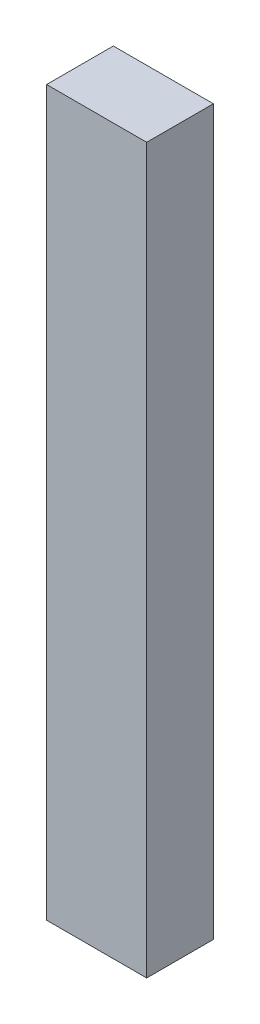
ISO-10303-21;
HEADER;
FILE_DESCRIPTION(('STEP AP214'),'2;1');
FILE_NAME('part.step','',(''),(''),'','','');
FILE_SCHEMA(('AUTOMOTIVE_DESIGN { 1 0 10303 214 1 1 1 1 }'));
ENDSEC;
DATA;
#1=APPLICATION_CONTEXT('core data for automotive mechanical design processes');
#2=APPLICATION_PROTOCOL_DEFINITION('international standard','automotive_design',2000,#1);
#3=PRODUCT_CONTEXT('',#1,'mechanical');
#4=PRODUCT('Part','Part','',(#3));
#5=PRODUCT_RELATED_PRODUCT_CATEGORY('part','',(#4));
#6=PRODUCT_DEFINITION_FORMATION('','',#4);
#7=PRODUCT_DEFINITION_CONTEXT('part definition',#1,'design');
#8=PRODUCT_DEFINITION('design','',#6,#7);
#9=PRODUCT_DEFINITION_SHAPE('','',#8);
#10=(LENGTH_UNIT() NAMED_UNIT(*) SI_UNIT(.MILLI.,.METRE.));
#11=(NAMED_UNIT(*) PLANE_ANGLE_UNIT() SI_UNIT($,.RADIAN.));
#12=(NAMED_UNIT(*) SI_UNIT($,.STERADIAN.) SOLID_ANGLE_UNIT());
#13=UNCERTAINTY_MEASURE_WITH_UNIT(LENGTH_MEASURE(1.E-05),#10,'distance_accuracy_value','');
#14=(GEOMETRIC_REPRESENTATION_CONTEXT(3) GLOBAL_UNCERTAINTY_ASSIGNED_CONTEXT((#13)) GLOBAL_UNIT_ASSIGNED_CONTEXT((#10,
#11,#12)) REPRESENTATION_CONTEXT('',''));
#15=CARTESIAN_POINT('',(0.,0.,0.));
#16=DIRECTION('',(0.,0.,1.));
#17=DIRECTION('',(1.,0.,0.));
#18=AXIS2_PLACEMENT_3D('',#15,#16,#17);
#19=CARTESIAN_POINT('',(-47.4736842105263,217.,-7.18421052631578));
#20=DIRECTION('',(1.,0.,0.));
#21=DIRECTION('',(0.,0.,-1.));
#22=AXIS2_PLACEMENT_3D('',#19,#20,#21);
#23=PLANE('',#22);
#24=DIRECTION('',(0.,0.,1.));
#25=VECTOR('',#24,1.);
#26=CARTESIAN_POINT('',(-47.4736842105263,0.,-7.18421052631578));
#27=LINE('',#26,#25);
#28=CARTESIAN_POINT('',(-47.4736842105263,0.,-7.18421052631578));
#29=VERTEX_POINT('',#28);
#30=CARTESIAN_POINT('',(-47.4736842105263,0.,12.8157894736842));
#31=VERTEX_POINT('',#30);
#32=EDGE_CURVE('E104',#29,#31,#27,.T.);
#33=ORIENTED_EDGE('',*,*,#32,.T.);
#34=DIRECTION('',(0.,-1.,0.));
#35=VECTOR('',#34,1.);
#36=CARTESIAN_POINT('',(-47.4736842105263,217.,12.8157894736842));
#37=LINE('',#36,#35);
#38=CARTESIAN_POINT('',(-47.4736842105263,217.,12.8157894736842));
#39=VERTEX_POINT('',#38);
#40=EDGE_CURVE('E11',#39,#31,#37,.T.);
#41=ORIENTED_EDGE('',*,*,#40,.F.);
#42=DIRECTION('',(0.,0.,1.));
#43=VECTOR('',#42,1.);
#44=CARTESIAN_POINT('',(-47.4736842105263,217.,-7.18421052631578));
#45=LINE('',#44,#43);
#46=CARTESIAN_POINT('',(-47.4736842105263,217.,-7.18421052631578));
#47=VERTEX_POINT('',#46);
#48=EDGE_CURVE('E92',#47,#39,#45,.T.);
#49=ORIENTED_EDGE('',*,*,#48,.F.);
#50=DIRECTION('',(0.,-1.,0.));
#51=VECTOR('',#50,1.);
#52=CARTESIAN_POINT('',(-47.4736842105263,217.,-7.18421052631578));
#53=LINE('',#52,#51);
#54=EDGE_CURVE('E100',#47,#29,#53,.T.);
#55=ORIENTED_EDGE('',*,*,#54,.T.);
#56=EDGE_LOOP('',(#33,#41,#49,#55));
#57=FACE_BOUND('',#56,.T.);
#58=ADVANCED_FACE('F41',(#57),#23,.F.);
#59=CARTESIAN_POINT('',(-47.4736842105263,217.,12.8157894736842));
#60=DIRECTION('',(0.,0.,-1.));
#61=DIRECTION('',(-1.,0.,0.));
#62=AXIS2_PLACEMENT_3D('',#59,#60,#61);
#63=PLANE('',#62);
#64=DIRECTION('',(1.,0.,0.));
#65=VECTOR('',#64,1.);
#66=CARTESIAN_POINT('',(-47.4736842105263,0.,12.8157894736842));
#67=LINE('',#66,#65);
#68=CARTESIAN_POINT('',(-17.4736842105263,0.,12.8157894736842));
#69=VERTEX_POINT('',#68);
#70=EDGE_CURVE('E96',#31,#69,#67,.T.);
#71=ORIENTED_EDGE('',*,*,#70,.T.);
#72=DIRECTION('',(0.,-1.,0.));
#73=VECTOR('',#72,1.);
#74=CARTESIAN_POINT('',(-17.4736842105263,217.,12.8157894736842));
#75=LINE('',#74,#73);
#76=CARTESIAN_POINT('',(-17.4736842105263,217.,12.8157894736842));
#77=VERTEX_POINT('',#76);
#78=EDGE_CURVE('E49',#77,#69,#75,.T.);
#79=ORIENTED_EDGE('',*,*,#78,.F.);
#80=DIRECTION('',(1.,0.,0.));
#81=VECTOR('',#80,1.);
#82=CARTESIAN_POINT('',(-47.4736842105263,217.,12.8157894736842));
#83=LINE('',#82,#81);
#84=EDGE_CURVE('E87',#39,#77,#83,.T.);
#85=ORIENTED_EDGE('',*,*,#84,.F.);
#86=ORIENTED_EDGE('',*,*,#40,.T.);
#87=EDGE_LOOP('',(#71,#79,#85,#86));
#88=FACE_BOUND('',#87,.T.);
#89=ADVANCED_FACE('F95',(#88),#63,.F.);
#90=CARTESIAN_POINT('',(-17.4736842105263,217.,-7.18421052631578));
#91=DIRECTION('',(-1.,0.,0.));
#92=DIRECTION('',(0.,0.,1.));
#93=AXIS2_PLACEMENT_3D('',#90,#91,#92);
#94=PLANE('',#93);
#95=DIRECTION('',(0.,0.,-1.));
#96=VECTOR('',#95,1.);
#97=CARTESIAN_POINT('',(-17.4736842105263,0.,-7.18421052631578));
#98=LINE('',#97,#96);
#99=CARTESIAN_POINT('',(-17.4736842105263,0.,-7.18421052631578));
#100=VERTEX_POINT('',#99);
#101=EDGE_CURVE('E74',#69,#100,#98,.T.);
#102=ORIENTED_EDGE('',*,*,#101,.T.);
#103=DIRECTION('',(0.,-1.,0.));
#104=VECTOR('',#103,1.);
#105=CARTESIAN_POINT('',(-17.4736842105263,217.,-7.18421052631578));
#106=LINE('',#105,#104);
#107=CARTESIAN_POINT('',(-17.4736842105263,217.,-7.18421052631578));
#108=VERTEX_POINT('',#107);
#109=EDGE_CURVE('E97',#108,#100,#106,.T.);
#110=ORIENTED_EDGE('',*,*,#109,.F.);
#111=DIRECTION('',(0.,0.,-1.));
#112=VECTOR('',#111,1.);
#113=CARTESIAN_POINT('',(-17.4736842105263,217.,-7.18421052631578));
#114=LINE('',#113,#112);
#115=EDGE_CURVE('E90',#77,#108,#114,.T.);
#116=ORIENTED_EDGE('',*,*,#115,.F.);
#117=ORIENTED_EDGE('',*,*,#78,.T.);
#118=EDGE_LOOP('',(#102,#110,#116,#117));
#119=FACE_BOUND('',#118,.T.);
#120=ADVANCED_FACE('F98',(#119),#94,.F.);
#121=CARTESIAN_POINT('',(-47.4736842105263,217.,-7.18421052631578));
#122=DIRECTION('',(0.,0.,1.));
#123=DIRECTION('',(1.,0.,0.));
#124=AXIS2_PLACEMENT_3D('',#121,#122,#123);
#125=PLANE('',#124);
#126=DIRECTION('',(-1.,0.,0.));
#127=VECTOR('',#126,1.);
#128=CARTESIAN_POINT('',(-47.4736842105263,0.,-7.18421052631578));
#129=LINE('',#128,#127);
#130=EDGE_CURVE('E80',#100,#29,#129,.T.);
#131=ORIENTED_EDGE('',*,*,#130,.T.);
#132=ORIENTED_EDGE('',*,*,#54,.F.);
#133=DIRECTION('',(-1.,0.,0.));
#134=VECTOR('',#133,1.);
#135=CARTESIAN_POINT('',(-47.4736842105263,217.,-7.18421052631578));
#136=LINE('',#135,#134);
#137=EDGE_CURVE('E57',#108,#47,#136,.T.);
#138=ORIENTED_EDGE('',*,*,#137,.F.);
#139=ORIENTED_EDGE('',*,*,#109,.T.);
#140=EDGE_LOOP('',(#131,#132,#138,#139));
#141=FACE_BOUND('',#140,.T.);
#142=ADVANCED_FACE('F111',(#141),#125,.F.);
#143=CARTESIAN_POINT('',(0.,217.,0.));
#144=DIRECTION('',(0.,1.,0.));
#145=DIRECTION('',(0.,0.,1.));
#146=AXIS2_PLACEMENT_3D('',#143,#144,#145);
#147=PLANE('',#146);
#148=ORIENTED_EDGE('',*,*,#48,.T.);
#149=ORIENTED_EDGE('',*,*,#84,.T.);
#150=ORIENTED_EDGE('',*,*,#115,.T.);
#151=ORIENTED_EDGE('',*,*,#137,.T.);
#152=EDGE_LOOP('',(#148,#149,#150,#151));
#153=FACE_BOUND('',#152,.T.);
#154=ADVANCED_FACE('F88',(#153),#147,.T.);
#155=CARTESIAN_POINT('',(0.,0.,0.));
#156=DIRECTION('',(0.,1.,0.));
#157=DIRECTION('',(0.,0.,1.));
#158=AXIS2_PLACEMENT_3D('',#155,#156,#157);
#159=PLANE('',#158);
#160=ORIENTED_EDGE('',*,*,#32,.F.);
#161=ORIENTED_EDGE('',*,*,#130,.F.);
#162=ORIENTED_EDGE('',*,*,#101,.F.);
#163=ORIENTED_EDGE('',*,*,#70,.F.);
#164=EDGE_LOOP('',(#160,#161,#162,#163));
#165=FACE_BOUND('',#164,.T.);
#166=ADVANCED_FACE('F114',(#165),#159,.F.);
#167=CLOSED_SHELL('',(#58,#89,#120,#142,#154,#166));
#168=MANIFOLD_SOLID_BREP('B2',#167);
#169=ADVANCED_BREP_SHAPE_REPRESENTATION('',(#18,#168),#14);
#170=SHAPE_DEFINITION_REPRESENTATION(#9,#169);
ENDSEC;
END-ISO-10303-21;
